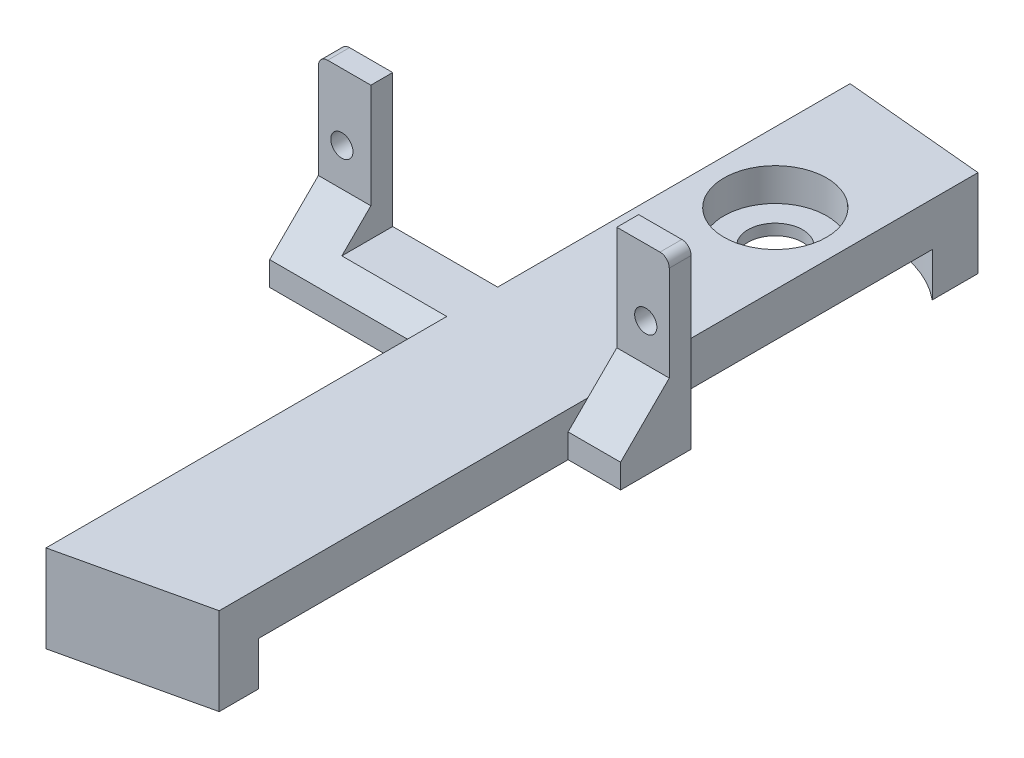
ISO-10303-21;
HEADER;
FILE_DESCRIPTION(('STEP AP214'),'2;1');
FILE_NAME('part.step','',(''),(''),'','','');
FILE_SCHEMA(('AUTOMOTIVE_DESIGN { 1 0 10303 214 1 1 1 1 }'));
ENDSEC;
DATA;
#1=APPLICATION_CONTEXT('core data for automotive mechanical design processes');
#2=APPLICATION_PROTOCOL_DEFINITION('international standard','automotive_design',2000,#1);
#3=PRODUCT_CONTEXT('',#1,'mechanical');
#4=PRODUCT('Part','Part','',(#3));
#5=PRODUCT_RELATED_PRODUCT_CATEGORY('part','',(#4));
#6=PRODUCT_DEFINITION_FORMATION('','',#4);
#7=PRODUCT_DEFINITION_CONTEXT('part definition',#1,'design');
#8=PRODUCT_DEFINITION('design','',#6,#7);
#9=PRODUCT_DEFINITION_SHAPE('','',#8);
#10=(LENGTH_UNIT() NAMED_UNIT(*) SI_UNIT(.MILLI.,.METRE.));
#11=(NAMED_UNIT(*) PLANE_ANGLE_UNIT() SI_UNIT($,.RADIAN.));
#12=(NAMED_UNIT(*) SI_UNIT($,.STERADIAN.) SOLID_ANGLE_UNIT());
#13=UNCERTAINTY_MEASURE_WITH_UNIT(LENGTH_MEASURE(1.E-05),#10,'distance_accuracy_value','');
#14=(GEOMETRIC_REPRESENTATION_CONTEXT(3) GLOBAL_UNCERTAINTY_ASSIGNED_CONTEXT((#13)) GLOBAL_UNIT_ASSIGNED_CONTEXT((#10,
#11,#12)) REPRESENTATION_CONTEXT('',''));
#15=CARTESIAN_POINT('',(0.,0.,0.));
#16=DIRECTION('',(0.,0.,1.));
#17=DIRECTION('',(1.,0.,0.));
#18=AXIS2_PLACEMENT_3D('',#15,#16,#17);
#19=CARTESIAN_POINT('',(24.0462381627888,-9.09999999999987,7.665828595555));
#20=DIRECTION('',(0.,-0.70856176119434,-0.705648801156195));
#21=DIRECTION('',(0.,0.705648801156195,-0.70856176119434));
#22=AXIS2_PLACEMENT_3D('',#19,#20,#21);
#23=PLANE('',#22);
#24=DIRECTION('',(-1.,0.,0.));
#25=VECTOR('',#24,1.);
#26=CARTESIAN_POINT('',(24.0462381627888,-7.89434521112556,6.45519679231599));
#27=LINE('',#26,#25);
#28=CARTESIAN_POINT('',(-1.64999999999999,-7.8943452111257,6.45519679231599));
#29=VERTEX_POINT('',#28);
#30=CARTESIAN_POINT('',(-16.05,-7.89434521112579,6.45519679231599));
#31=VERTEX_POINT('',#30);
#32=EDGE_CURVE('E241',#29,#31,#27,.T.);
#33=ORIENTED_EDGE('',*,*,#32,.F.);
#34=DIRECTION('',(0.,0.705648801156195,-0.70856176119434));
#35=VECTOR('',#34,1.);
#36=CARTESIAN_POINT('',(-1.65000000000002,-5.2671182257889,3.8171244584051));
#37=LINE('',#36,#35);
#38=CARTESIAN_POINT('',(-1.65000000000001,-6.10000000000001,4.65344441790159));
#39=VERTEX_POINT('',#38);
#40=EDGE_CURVE('E248',#29,#39,#37,.T.);
#41=ORIENTED_EDGE('',*,*,#40,.T.);
#42=DIRECTION('',(1.,0.,0.));
#43=VECTOR('',#42,1.);
#44=CARTESIAN_POINT('',(24.0462381627888,-6.09999999999987,4.65344441790159));
#45=LINE('',#44,#43);
#46=CARTESIAN_POINT('',(-11.25,-6.10000000000007,4.65344441790159));
#47=VERTEX_POINT('',#46);
#48=EDGE_CURVE('E424',#47,#39,#45,.T.);
#49=ORIENTED_EDGE('',*,*,#48,.F.);
#50=DIRECTION('',(0.,-0.705648801156195,0.70856176119434));
#51=VECTOR('',#50,1.);
#52=CARTESIAN_POINT('',(-11.25,-9.10000000000007,7.665828595555));
#53=LINE('',#52,#51);
#54=CARTESIAN_POINT('',(-11.25,-3.45746412666863,2.));
#55=VERTEX_POINT('',#54);
#56=EDGE_CURVE('E417',#55,#47,#53,.T.);
#57=ORIENTED_EDGE('',*,*,#56,.F.);
#58=DIRECTION('',(-1.,0.,0.));
#59=VECTOR('',#58,1.);
#60=CARTESIAN_POINT('',(24.0462381627887,-3.45746412666856,2.));
#61=LINE('',#60,#59);
#62=CARTESIAN_POINT('',(-16.05,-3.45746412666879,2.));
#63=VERTEX_POINT('',#62);
#64=EDGE_CURVE('E480',#55,#63,#61,.T.);
#65=ORIENTED_EDGE('',*,*,#64,.T.);
#66=DIRECTION('',(0.,0.705648801156195,-0.70856176119434));
#67=VECTOR('',#66,1.);
#68=CARTESIAN_POINT('',(-16.05,-9.10000000000012,7.66582859555502));
#69=LINE('',#68,#67);
#70=EDGE_CURVE('E478',#31,#63,#69,.T.);
#71=ORIENTED_EDGE('',*,*,#70,.F.);
#72=EDGE_LOOP('',(#33,#41,#49,#57,#65,#71));
#73=FACE_BOUND('',#72,.T.);
#74=ADVANCED_FACE('F35',(#73),#23,.F.);
#75=CARTESIAN_POINT('',(-16.05,0.,2.));
#76=DIRECTION('',(1.,0.,0.));
#77=DIRECTION('',(0.,1.,0.));
#78=AXIS2_PLACEMENT_3D('',#75,#76,#77);
#79=PLANE('',#78);
#80=DIRECTION('',(0.,1.,0.));
#81=VECTOR('',#80,1.);
#82=CARTESIAN_POINT('',(-16.05,-10.1000000000001,6.45519679231599));
#83=LINE('',#82,#81);
#84=CARTESIAN_POINT('',(-16.05,-10.1000000000001,6.45519679231599));
#85=VERTEX_POINT('',#84);
#86=EDGE_CURVE('E468',#85,#31,#83,.T.);
#87=ORIENTED_EDGE('',*,*,#86,.T.);
#88=ORIENTED_EDGE('',*,*,#70,.T.);
#89=DIRECTION('',(0.,-1.,0.));
#90=VECTOR('',#89,1.);
#91=CARTESIAN_POINT('',(-16.05,0.,2.));
#92=LINE('',#91,#90);
#93=CARTESIAN_POINT('',(-16.05,5.25,2.));
#94=VERTEX_POINT('',#93);
#95=EDGE_CURVE('E377',#94,#63,#92,.T.);
#96=ORIENTED_EDGE('',*,*,#95,.F.);
#97=DIRECTION('',(0.,0.,-1.));
#98=VECTOR('',#97,1.);
#99=CARTESIAN_POINT('',(-16.05,5.25,2.));
#100=LINE('',#99,#98);
#101=CARTESIAN_POINT('',(-16.05,5.25,0.));
#102=VERTEX_POINT('',#101);
#103=EDGE_CURVE('E387',#94,#102,#100,.T.);
#104=ORIENTED_EDGE('',*,*,#103,.T.);
#105=DIRECTION('',(0.,-1.,0.));
#106=VECTOR('',#105,1.);
#107=CARTESIAN_POINT('',(-16.05,0.,0.));
#108=LINE('',#107,#106);
#109=CARTESIAN_POINT('',(-16.05,-10.1000000000001,0.));
#110=VERTEX_POINT('',#109);
#111=EDGE_CURVE('E390',#102,#110,#108,.T.);
#112=ORIENTED_EDGE('',*,*,#111,.T.);
#113=DIRECTION('',(0.,0.,-1.));
#114=VECTOR('',#113,1.);
#115=CARTESIAN_POINT('',(-16.05,-10.1000000000001,6.45519679231599));
#116=LINE('',#115,#114);
#117=EDGE_CURVE('E440',#85,#110,#116,.T.);
#118=ORIENTED_EDGE('',*,*,#117,.F.);
#119=EDGE_LOOP('',(#87,#88,#96,#104,#112,#118));
#120=FACE_BOUND('',#119,.T.);
#121=ADVANCED_FACE('F539',(#120),#79,.F.);
#122=DIRECTION('',(0.,-0.705648801156195,0.70856176119434));
#123=VECTOR('',#122,1.);
#124=CARTESIAN_POINT('',(11.25,-5.26711822578882,3.8171244584051));
#125=LINE('',#124,#123);
#126=CARTESIAN_POINT('',(11.25,-6.09999999999994,4.65344441790159));
#127=VERTEX_POINT('',#126);
#128=CARTESIAN_POINT('',(11.25,-7.89434521112563,6.45519679231599));
#129=VERTEX_POINT('',#128);
#130=EDGE_CURVE('E226',#127,#129,#125,.T.);
#131=ORIENTED_EDGE('',*,*,#130,.T.);
#132=DIRECTION('',(1.,0.,0.));
#133=VECTOR('',#132,1.);
#134=CARTESIAN_POINT('',(24.0462381627888,-7.89434521112556,6.45519679231599));
#135=LINE('',#134,#133);
#136=CARTESIAN_POINT('',(16.05,-7.8943452111256,6.45519679231599));
#137=VERTEX_POINT('',#136);
#138=EDGE_CURVE('E235',#129,#137,#135,.T.);
#139=ORIENTED_EDGE('',*,*,#138,.T.);
#140=DIRECTION('',(0.,0.705648801156195,-0.70856176119434));
#141=VECTOR('',#140,1.);
#142=CARTESIAN_POINT('',(16.05,-9.09999999999991,7.665828595555));
#143=LINE('',#142,#141);
#144=CARTESIAN_POINT('',(16.05,-3.45746412666861,2.));
#145=VERTEX_POINT('',#144);
#146=EDGE_CURVE('E254',#137,#145,#143,.T.);
#147=ORIENTED_EDGE('',*,*,#146,.T.);
#148=CARTESIAN_POINT('',(11.25,-3.45746412666863,2.));
#149=VERTEX_POINT('',#148);
#150=EDGE_CURVE('E481',#145,#149,#61,.T.);
#151=ORIENTED_EDGE('',*,*,#150,.T.);
#152=DIRECTION('',(0.,0.705648801156195,-0.70856176119434));
#153=VECTOR('',#152,1.);
#154=CARTESIAN_POINT('',(11.25,-9.09999999999994,7.665828595555));
#155=LINE('',#154,#153);
#156=EDGE_CURVE('E246',#127,#149,#155,.T.);
#157=ORIENTED_EDGE('',*,*,#156,.F.);
#158=EDGE_LOOP('',(#131,#139,#147,#151,#157));
#159=FACE_BOUND('',#158,.T.);
#160=ADVANCED_FACE('F244',(#159),#23,.F.);
#161=CARTESIAN_POINT('',(0.,0.,2.));
#162=DIRECTION('',(0.,0.,1.));
#163=DIRECTION('',(1.,0.,0.));
#164=AXIS2_PLACEMENT_3D('',#161,#162,#163);
#165=PLANE('',#164);
#166=CARTESIAN_POINT('',(-13.9,0.,2.));
#167=DIRECTION('',(0.,0.,1.));
#168=DIRECTION('',(1.,0.,0.));
#169=AXIS2_PLACEMENT_3D('',#166,#167,#168);
#170=CIRCLE('',#169,1.016);
#171=CARTESIAN_POINT('',(-12.884,0.,2.));
#172=VERTEX_POINT('',#171);
#173=EDGE_CURVE('E374',#172,#172,#170,.T.);
#174=ORIENTED_EDGE('',*,*,#173,.F.);
#175=EDGE_LOOP('',(#174));
#176=FACE_BOUND('',#175,.T.);
#177=ORIENTED_EDGE('',*,*,#95,.T.);
#178=ORIENTED_EDGE('',*,*,#64,.F.);
#179=DIRECTION('',(0.,-1.,0.));
#180=VECTOR('',#179,1.);
#181=CARTESIAN_POINT('',(-11.25,0.,2.));
#182=LINE('',#181,#180);
#183=CARTESIAN_POINT('',(-11.25,6.1,2.));
#184=VERTEX_POINT('',#183);
#185=EDGE_CURVE('E381',#184,#55,#182,.T.);
#186=ORIENTED_EDGE('',*,*,#185,.F.);
#187=DIRECTION('',(-1.,0.,0.));
#188=VECTOR('',#187,1.);
#189=CARTESIAN_POINT('',(0.,6.1,2.));
#190=LINE('',#189,#188);
#191=CARTESIAN_POINT('',(-15.2,6.1,2.));
#192=VERTEX_POINT('',#191);
#193=EDGE_CURVE('E383',#184,#192,#190,.T.);
#194=ORIENTED_EDGE('',*,*,#193,.T.);
#195=CARTESIAN_POINT('',(-15.2,5.25,2.));
#196=DIRECTION('',(0.,0.,1.));
#197=DIRECTION('',(1.,0.,0.));
#198=AXIS2_PLACEMENT_3D('',#195,#196,#197);
#199=CIRCLE('',#198,0.850000000000002);
#200=EDGE_CURVE('E385',#192,#94,#199,.T.);
#201=ORIENTED_EDGE('',*,*,#200,.T.);
#202=EDGE_LOOP('',(#177,#178,#186,#194,#201));
#203=FACE_BOUND('',#202,.T.);
#204=ADVANCED_FACE('F550',(#176,#203),#165,.T.);
#205=CARTESIAN_POINT('',(0.,-9.1,2.));
#206=DIRECTION('',(0.,0.,-1.));
#207=DIRECTION('',(-1.,0.,0.));
#208=AXIS2_PLACEMENT_3D('',#205,#206,#207);
#209=PLANE('',#208);
#210=CARTESIAN_POINT('',(13.9,0.,2.));
#211=DIRECTION('',(0.,0.,1.));
#212=DIRECTION('',(1.,0.,0.));
#213=AXIS2_PLACEMENT_3D('',#210,#211,#212);
#214=CIRCLE('',#213,1.016);
#215=CARTESIAN_POINT('',(14.916,0.,2.));
#216=VERTEX_POINT('',#215);
#217=EDGE_CURVE('E302',#216,#216,#214,.T.);
#218=ORIENTED_EDGE('',*,*,#217,.F.);
#219=EDGE_LOOP('',(#218));
#220=FACE_BOUND('',#219,.T.);
#221=ORIENTED_EDGE('',*,*,#150,.F.);
#222=DIRECTION('',(0.,1.,0.));
#223=VECTOR('',#222,1.);
#224=CARTESIAN_POINT('',(16.05,-9.09999999999991,2.));
#225=LINE('',#224,#223);
#226=CARTESIAN_POINT('',(16.05,5.25,2.));
#227=VERTEX_POINT('',#226);
#228=EDGE_CURVE('E363',#145,#227,#225,.T.);
#229=ORIENTED_EDGE('',*,*,#228,.T.);
#230=CARTESIAN_POINT('',(15.2,5.25,2.));
#231=DIRECTION('',(0.,0.,1.));
#232=DIRECTION('',(1.,0.,0.));
#233=AXIS2_PLACEMENT_3D('',#230,#231,#232);
#234=CIRCLE('',#233,0.849999999999998);
#235=CARTESIAN_POINT('',(15.2,6.1,2.));
#236=VERTEX_POINT('',#235);
#237=EDGE_CURVE('E305',#227,#236,#234,.T.);
#238=ORIENTED_EDGE('',*,*,#237,.T.);
#239=DIRECTION('',(0.999998883397845,0.00149439053219066,0.));
#240=VECTOR('',#239,1.);
#241=CARTESIAN_POINT('',(-0.00908182738110785,6.07727166673534,2.));
#242=LINE('',#241,#240);
#243=CARTESIAN_POINT('',(11.25,6.09409715080671,2.));
#244=VERTEX_POINT('',#243);
#245=EDGE_CURVE('E308',#244,#236,#242,.T.);
#246=ORIENTED_EDGE('',*,*,#245,.F.);
#247=DIRECTION('',(0.,1.,0.));
#248=VECTOR('',#247,1.);
#249=CARTESIAN_POINT('',(11.25,0.,2.));
#250=LINE('',#249,#248);
#251=EDGE_CURVE('E311',#149,#244,#250,.T.);
#252=ORIENTED_EDGE('',*,*,#251,.F.);
#253=EDGE_LOOP('',(#221,#229,#238,#246,#252));
#254=FACE_BOUND('',#253,.T.);
#255=ADVANCED_FACE('F487',(#220,#254),#209,.F.);
#256=CARTESIAN_POINT('',(11.25,-9.09999999999994,0.));
#257=DIRECTION('',(-1.,0.,0.));
#258=DIRECTION('',(0.,-1.,0.));
#259=AXIS2_PLACEMENT_3D('',#256,#257,#258);
#260=PLANE('',#259);
#261=DIRECTION('',(0.,0.,1.));
#262=VECTOR('',#261,1.);
#263=CARTESIAN_POINT('',(11.25,-6.09999999999994,0.));
#264=LINE('',#263,#262);
#265=CARTESIAN_POINT('',(11.25,-6.09999999999994,38.3729605246783));
#266=VERTEX_POINT('',#265);
#267=EDGE_CURVE('E338',#127,#266,#264,.T.);
#268=ORIENTED_EDGE('',*,*,#267,.T.);
#269=DIRECTION('',(0.,1.,0.));
#270=VECTOR('',#269,1.);
#271=CARTESIAN_POINT('',(11.25,-9.09999999999994,38.3729605246783));
#272=LINE('',#271,#270);
#273=CARTESIAN_POINT('',(11.2500000000001,-14.0999999999999,38.3729605246783));
#274=VERTEX_POINT('',#273);
#275=EDGE_CURVE('E360',#274,#266,#272,.T.);
#276=ORIENTED_EDGE('',*,*,#275,.F.);
#277=DIRECTION('',(0.,0.,1.));
#278=VECTOR('',#277,1.);
#279=CARTESIAN_POINT('',(11.2500000000001,-14.0999999999999,0.));
#280=LINE('',#279,#278);
#281=CARTESIAN_POINT('',(11.2500000000001,-14.0999999999999,34.7915780127412));
#282=VERTEX_POINT('',#281);
#283=EDGE_CURVE('E285',#282,#274,#280,.T.);
#284=ORIENTED_EDGE('',*,*,#283,.F.);
#285=DIRECTION('',(0.,1.,0.));
#286=VECTOR('',#285,1.);
#287=CARTESIAN_POINT('',(11.2500000000001,-14.0999999999999,34.7915780127412));
#288=LINE('',#287,#286);
#289=CARTESIAN_POINT('',(11.25,-10.0999999999999,34.7915780127412));
#290=VERTEX_POINT('',#289);
#291=EDGE_CURVE('E299',#282,#290,#288,.T.);
#292=ORIENTED_EDGE('',*,*,#291,.T.);
#293=DIRECTION('',(0.,0.,1.));
#294=VECTOR('',#293,1.);
#295=CARTESIAN_POINT('',(11.25,-10.0999999999999,6.45519679231599));
#296=LINE('',#295,#294);
#297=CARTESIAN_POINT('',(11.25,-10.0999999999999,6.45519679231599));
#298=VERTEX_POINT('',#297);
#299=EDGE_CURVE('E50',#298,#290,#296,.T.);
#300=ORIENTED_EDGE('',*,*,#299,.F.);
#301=DIRECTION('',(0.,1.,0.));
#302=VECTOR('',#301,1.);
#303=CARTESIAN_POINT('',(11.25,-10.0999999999999,6.45519679231599));
#304=LINE('',#303,#302);
#305=EDGE_CURVE('E222',#298,#129,#304,.T.);
#306=ORIENTED_EDGE('',*,*,#305,.T.);
#307=ORIENTED_EDGE('',*,*,#130,.F.);
#308=EDGE_LOOP('',(#268,#276,#284,#292,#300,#306,#307));
#309=FACE_BOUND('',#308,.T.);
#310=ADVANCED_FACE('F224',(#309),#260,.F.);
#311=CARTESIAN_POINT('',(-1.65,-9.10000000000001,0.));
#312=DIRECTION('',(1.,0.,0.));
#313=DIRECTION('',(0.,1.,0.));
#314=AXIS2_PLACEMENT_3D('',#311,#312,#313);
#315=PLANE('',#314);
#316=ORIENTED_EDGE('',*,*,#40,.F.);
#317=DIRECTION('',(0.,1.,0.));
#318=VECTOR('',#317,1.);
#319=CARTESIAN_POINT('',(-1.64999999999999,-10.1,6.45519679231599));
#320=LINE('',#319,#318);
#321=CARTESIAN_POINT('',(-1.64999999999999,-10.1,6.45519679231599));
#322=VERTEX_POINT('',#321);
#323=EDGE_CURVE('E470',#322,#29,#320,.T.);
#324=ORIENTED_EDGE('',*,*,#323,.F.);
#325=DIRECTION('',(0.,0.,-1.));
#326=VECTOR('',#325,1.);
#327=CARTESIAN_POINT('',(-1.64999999999999,-10.1,39.1));
#328=LINE('',#327,#326);
#329=CARTESIAN_POINT('',(-1.64999999999999,-10.1,39.1));
#330=VERTEX_POINT('',#329);
#331=EDGE_CURVE('E987',#330,#322,#328,.T.);
#332=ORIENTED_EDGE('',*,*,#331,.F.);
#333=DIRECTION('',(0.,1.,0.));
#334=VECTOR('',#333,1.);
#335=CARTESIAN_POINT('',(-1.64999999999997,-14.1,39.1));
#336=LINE('',#335,#334);
#337=CARTESIAN_POINT('',(-1.64999999999997,-14.1,39.1));
#338=VERTEX_POINT('',#337);
#339=EDGE_CURVE('E58',#338,#330,#336,.T.);
#340=ORIENTED_EDGE('',*,*,#339,.F.);
#341=DIRECTION('',(0.,0.,-1.));
#342=VECTOR('',#341,1.);
#343=CARTESIAN_POINT('',(-1.64999999999997,-14.1,0.));
#344=LINE('',#343,#342);
#345=CARTESIAN_POINT('',(-1.64999999999997,-14.1,41.3173022082031));
#346=VERTEX_POINT('',#345);
#347=EDGE_CURVE('E291',#346,#338,#344,.T.);
#348=ORIENTED_EDGE('',*,*,#347,.F.);
#349=DIRECTION('',(0.,1.,0.));
#350=VECTOR('',#349,1.);
#351=CARTESIAN_POINT('',(-1.65,-9.10000000000001,41.3173022082031));
#352=LINE('',#351,#350);
#353=CARTESIAN_POINT('',(-1.65000000000002,-6.10000000000001,41.3173022082031));
#354=VERTEX_POINT('',#353);
#355=EDGE_CURVE('E358',#346,#354,#352,.T.);
#356=ORIENTED_EDGE('',*,*,#355,.T.);
#357=DIRECTION('',(0.,0.,-1.));
#358=VECTOR('',#357,1.);
#359=CARTESIAN_POINT('',(-1.65000000000002,-6.10000000000001,0.));
#360=LINE('',#359,#358);
#361=EDGE_CURVE('E343',#354,#39,#360,.T.);
#362=ORIENTED_EDGE('',*,*,#361,.T.);
#363=EDGE_LOOP('',(#316,#324,#332,#340,#348,#356,#362));
#364=FACE_BOUND('',#363,.T.);
#365=ADVANCED_FACE('F579',(#364),#315,.F.);
#366=CARTESIAN_POINT('',(0.,-6.1,0.));
#367=DIRECTION('',(0.,-1.,0.));
#368=DIRECTION('',(1.,0.,0.));
#369=AXIS2_PLACEMENT_3D('',#366,#367,#368);
#370=PLANE('',#369);
#371=DIRECTION('',(0.,0.,-1.));
#372=VECTOR('',#371,1.);
#373=CARTESIAN_POINT('',(11.25,-6.1,2.));
#374=LINE('',#373,#372);
#375=CARTESIAN_POINT('',(11.25,-6.1,0.));
#376=VERTEX_POINT('',#375);
#377=EDGE_CURVE('E313',#127,#376,#374,.T.);
#378=ORIENTED_EDGE('',*,*,#377,.T.);
#379=DIRECTION('',(0.,0.,-1.));
#380=VECTOR('',#379,1.);
#381=CARTESIAN_POINT('',(11.25,-6.09999999999994,0.));
#382=LINE('',#381,#380);
#383=CARTESIAN_POINT('',(11.25,-6.09999999999994,-31.0432795450217));
#384=VERTEX_POINT('',#383);
#385=EDGE_CURVE('E336',#376,#384,#382,.T.);
#386=ORIENTED_EDGE('',*,*,#385,.T.);
#387=DIRECTION('',(0.995722585399708,0.,0.0923933597447412));
#388=VECTOR('',#387,1.);
#389=CARTESIAN_POINT('',(2.95196043990108,-6.09999999999999,-31.8132568112745));
#390=LINE('',#389,#388);
#391=CARTESIAN_POINT('',(-1.65000000000002,-6.10000000000001,-32.2402739269747));
#392=VERTEX_POINT('',#391);
#393=EDGE_CURVE('E333',#392,#384,#390,.T.);
#394=ORIENTED_EDGE('',*,*,#393,.F.);
#395=DIRECTION('',(0.,0.,-1.));
#396=VECTOR('',#395,1.);
#397=CARTESIAN_POINT('',(-1.65000000000002,-6.10000000000001,0.));
#398=LINE('',#397,#396);
#399=CARTESIAN_POINT('',(-1.65000000000002,-6.10000000000001,0.));
#400=VERTEX_POINT('',#399);
#401=EDGE_CURVE('E348',#400,#392,#398,.T.);
#402=ORIENTED_EDGE('',*,*,#401,.F.);
#403=DIRECTION('',(-1.,0.,0.));
#404=VECTOR('',#403,1.);
#405=CARTESIAN_POINT('',(0.,-6.1,0.));
#406=LINE('',#405,#404);
#407=CARTESIAN_POINT('',(-11.25,-6.1,0.));
#408=VERTEX_POINT('',#407);
#409=EDGE_CURVE('E345',#400,#408,#406,.T.);
#410=ORIENTED_EDGE('',*,*,#409,.T.);
#411=DIRECTION('',(0.,0.,-1.));
#412=VECTOR('',#411,1.);
#413=CARTESIAN_POINT('',(-11.25,-6.1,2.));
#414=LINE('',#413,#412);
#415=EDGE_CURVE('E11',#47,#408,#414,.T.);
#416=ORIENTED_EDGE('',*,*,#415,.F.);
#417=ORIENTED_EDGE('',*,*,#48,.T.);
#418=ORIENTED_EDGE('',*,*,#361,.F.);
#419=DIRECTION('',(0.974927898017834,0.,-0.222520996012798));
#420=VECTOR('',#419,1.);
#421=CARTESIAN_POINT('',(8.88175442612116,-6.09999999999995,38.913497281267));
#422=LINE('',#421,#420);
#423=EDGE_CURVE('E340',#354,#266,#422,.T.);
#424=ORIENTED_EDGE('',*,*,#423,.T.);
#425=ORIENTED_EDGE('',*,*,#267,.F.);
#426=EDGE_LOOP('',(#378,#386,#394,#402,#410,#416,#417,#418,#424,#425));
#427=FACE_BOUND('',#426,.T.);
#428=CARTESIAN_POINT('',(4.74999999999999,-6.09999999999998,-19.));
#429=DIRECTION('',(0.,-1.,0.));
#430=DIRECTION('',(1.,0.,0.));
#431=AXIS2_PLACEMENT_3D('',#428,#429,#430);
#432=CIRCLE('',#431,4.7);
#433=CARTESIAN_POINT('',(9.45,-6.09999999999995,-19.));
#434=VERTEX_POINT('',#433);
#435=EDGE_CURVE('E350',#434,#434,#432,.T.);
#436=ORIENTED_EDGE('',*,*,#435,.T.);
#437=EDGE_LOOP('',(#436));
#438=FACE_BOUND('',#437,.T.);
#439=ADVANCED_FACE('F421',(#427,#438),#370,.F.);
#440=CARTESIAN_POINT('',(-11.25,0.,2.));
#441=DIRECTION('',(1.,0.,0.));
#442=DIRECTION('',(0.,1.,0.));
#443=AXIS2_PLACEMENT_3D('',#440,#441,#442);
#444=PLANE('',#443);
#445=ORIENTED_EDGE('',*,*,#185,.T.);
#446=ORIENTED_EDGE('',*,*,#56,.T.);
#447=ORIENTED_EDGE('',*,*,#415,.T.);
#448=DIRECTION('',(0.,-1.,0.));
#449=VECTOR('',#448,1.);
#450=CARTESIAN_POINT('',(-11.25,0.,0.));
#451=LINE('',#450,#449);
#452=CARTESIAN_POINT('',(-11.25,6.1,0.));
#453=VERTEX_POINT('',#452);
#454=EDGE_CURVE('E392',#453,#408,#451,.T.);
#455=ORIENTED_EDGE('',*,*,#454,.F.);
#456=DIRECTION('',(0.,0.,-1.));
#457=VECTOR('',#456,1.);
#458=CARTESIAN_POINT('',(-11.25,6.1,2.));
#459=LINE('',#458,#457);
#460=EDGE_CURVE('E43',#184,#453,#459,.T.);
#461=ORIENTED_EDGE('',*,*,#460,.F.);
#462=EDGE_LOOP('',(#445,#446,#447,#455,#461));
#463=FACE_BOUND('',#462,.T.);
#464=ADVANCED_FACE('F414',(#463),#444,.T.);
#465=CARTESIAN_POINT('',(0.,6.1,2.));
#466=DIRECTION('',(0.,-1.,0.));
#467=DIRECTION('',(0.,0.,-1.));
#468=AXIS2_PLACEMENT_3D('',#465,#466,#467);
#469=PLANE('',#468);
#470=DIRECTION('',(-1.,0.,0.));
#471=VECTOR('',#470,1.);
#472=CARTESIAN_POINT('',(0.,6.1,0.));
#473=LINE('',#472,#471);
#474=CARTESIAN_POINT('',(-15.2,6.1,0.));
#475=VERTEX_POINT('',#474);
#476=EDGE_CURVE('E394',#453,#475,#473,.T.);
#477=ORIENTED_EDGE('',*,*,#476,.T.);
#478=DIRECTION('',(0.,0.,-1.));
#479=VECTOR('',#478,1.);
#480=CARTESIAN_POINT('',(-15.2,6.1,2.));
#481=LINE('',#480,#479);
#482=EDGE_CURVE('E399',#192,#475,#481,.T.);
#483=ORIENTED_EDGE('',*,*,#482,.F.);
#484=ORIENTED_EDGE('',*,*,#193,.F.);
#485=ORIENTED_EDGE('',*,*,#460,.T.);
#486=EDGE_LOOP('',(#477,#483,#484,#485));
#487=FACE_BOUND('',#486,.T.);
#488=ADVANCED_FACE('F404',(#487),#469,.F.);
#489=CARTESIAN_POINT('',(-13.9,0.,2.));
#490=DIRECTION('',(0.,0.,-1.));
#491=DIRECTION('',(-1.,0.,0.));
#492=AXIS2_PLACEMENT_3D('',#489,#490,#491);
#493=CYLINDRICAL_SURFACE('',#492,1.016);
#494=ORIENTED_EDGE('',*,*,#173,.T.);
#495=EDGE_LOOP('',(#494));
#496=FACE_BOUND('',#495,.T.);
#497=CARTESIAN_POINT('',(-13.9,0.,0.));
#498=DIRECTION('',(0.,0.,1.));
#499=DIRECTION('',(1.,0.,0.));
#500=AXIS2_PLACEMENT_3D('',#497,#498,#499);
#501=CIRCLE('',#500,1.016);
#502=CARTESIAN_POINT('',(-12.884,0.,0.));
#503=VERTEX_POINT('',#502);
#504=EDGE_CURVE('E373',#503,#503,#501,.T.);
#505=ORIENTED_EDGE('',*,*,#504,.F.);
#506=EDGE_LOOP('',(#505));
#507=FACE_BOUND('',#506,.T.);
#508=ADVANCED_FACE('F37',(#496,#507),#493,.F.);
#509=CARTESIAN_POINT('',(-15.2,5.25,2.));
#510=DIRECTION('',(0.,0.,-1.));
#511=DIRECTION('',(-1.,0.,0.));
#512=AXIS2_PLACEMENT_3D('',#509,#510,#511);
#513=CYLINDRICAL_SURFACE('',#512,0.850000000000002);
#514=CARTESIAN_POINT('',(-15.2,5.25,0.));
#515=DIRECTION('',(0.,0.,1.));
#516=DIRECTION('',(1.,0.,0.));
#517=AXIS2_PLACEMENT_3D('',#514,#515,#516);
#518=CIRCLE('',#517,0.850000000000002);
#519=EDGE_CURVE('E378',#475,#102,#518,.T.);
#520=ORIENTED_EDGE('',*,*,#519,.T.);
#521=ORIENTED_EDGE('',*,*,#103,.F.);
#522=ORIENTED_EDGE('',*,*,#200,.F.);
#523=ORIENTED_EDGE('',*,*,#482,.T.);
#524=EDGE_LOOP('',(#520,#521,#522,#523));
#525=FACE_BOUND('',#524,.T.);
#526=ADVANCED_FACE('F568',(#525),#513,.T.);
#527=CARTESIAN_POINT('',(0.,0.,0.));
#528=DIRECTION('',(0.,0.,1.));
#529=DIRECTION('',(1.,0.,0.));
#530=AXIS2_PLACEMENT_3D('',#527,#528,#529);
#531=PLANE('',#530);
#532=ORIENTED_EDGE('',*,*,#504,.T.);
#533=EDGE_LOOP('',(#532));
#534=FACE_BOUND('',#533,.T.);
#535=ORIENTED_EDGE('',*,*,#111,.F.);
#536=ORIENTED_EDGE('',*,*,#519,.F.);
#537=ORIENTED_EDGE('',*,*,#476,.F.);
#538=ORIENTED_EDGE('',*,*,#454,.T.);
#539=ORIENTED_EDGE('',*,*,#409,.F.);
#540=DIRECTION('',(0.,1.,0.));
#541=VECTOR('',#540,1.);
#542=CARTESIAN_POINT('',(-1.65,-9.10000000000001,0.));
#543=LINE('',#542,#541);
#544=CARTESIAN_POINT('',(-1.64999999999999,-10.1,0.));
#545=VERTEX_POINT('',#544);
#546=EDGE_CURVE('E356',#545,#400,#543,.T.);
#547=ORIENTED_EDGE('',*,*,#546,.F.);
#548=DIRECTION('',(1.,0.,0.));
#549=VECTOR('',#548,1.);
#550=CARTESIAN_POINT('',(-16.05,-10.1000000000001,0.));
#551=LINE('',#550,#549);
#552=EDGE_CURVE('E429',#110,#545,#551,.T.);
#553=ORIENTED_EDGE('',*,*,#552,.F.);
#554=EDGE_LOOP('',(#535,#536,#537,#538,#539,#547,#553));
#555=FACE_BOUND('',#554,.T.);
#556=ADVANCED_FACE('F412',(#534,#555),#531,.F.);
#557=CARTESIAN_POINT('',(2.9519604399011,-9.09999999999999,-31.8132568112745));
#558=DIRECTION('',(-0.0923933597447412,0.,0.995722585399708));
#559=DIRECTION('',(0.995722585399708,0.,0.0923933597447412));
#560=AXIS2_PLACEMENT_3D('',#557,#558,#559);
#561=PLANE('',#560);
#562=ORIENTED_EDGE('',*,*,#393,.T.);
#563=DIRECTION('',(0.,1.,0.));
#564=VECTOR('',#563,1.);
#565=CARTESIAN_POINT('',(11.25,-9.09999999999994,-31.0432795450217));
#566=LINE('',#565,#564);
#567=CARTESIAN_POINT('',(11.2500000000001,-14.0999999999999,-31.0432795450217));
#568=VERTEX_POINT('',#567);
#569=EDGE_CURVE('E370',#568,#384,#566,.T.);
#570=ORIENTED_EDGE('',*,*,#569,.F.);
#571=DIRECTION('',(0.995722585399708,0.,0.0923933597447412));
#572=VECTOR('',#571,1.);
#573=CARTESIAN_POINT('',(2.95196043990112,-14.1,-31.8132568112745));
#574=LINE('',#573,#572);
#575=CARTESIAN_POINT('',(-1.64999999999997,-14.1,-32.2402739269747));
#576=VERTEX_POINT('',#575);
#577=EDGE_CURVE('E265',#576,#568,#574,.T.);
#578=ORIENTED_EDGE('',*,*,#577,.F.);
#579=DIRECTION('',(0.,1.,0.));
#580=VECTOR('',#579,1.);
#581=CARTESIAN_POINT('',(-1.65,-9.10000000000001,-32.2402739269747));
#582=LINE('',#581,#580);
#583=EDGE_CURVE('E353',#576,#392,#582,.T.);
#584=ORIENTED_EDGE('',*,*,#583,.T.);
#585=EDGE_LOOP('',(#562,#570,#578,#584));
#586=FACE_BOUND('',#585,.T.);
#587=ADVANCED_FACE('F514',(#586),#561,.F.);
#588=CARTESIAN_POINT('',(11.25,-9.09999999999994,0.));
#589=DIRECTION('',(1.,0.,0.));
#590=DIRECTION('',(0.,1.,0.));
#591=AXIS2_PLACEMENT_3D('',#588,#589,#590);
#592=PLANE('',#591);
#593=DIRECTION('',(0.,1.,0.));
#594=VECTOR('',#593,1.);
#595=CARTESIAN_POINT('',(11.25,-9.09999999999994,0.));
#596=LINE('',#595,#594);
#597=CARTESIAN_POINT('',(11.25,-10.0999999999999,0.));
#598=VERTEX_POINT('',#597);
#599=EDGE_CURVE('E367',#598,#376,#596,.T.);
#600=ORIENTED_EDGE('',*,*,#599,.F.);
#601=DIRECTION('',(0.,0.,1.));
#602=VECTOR('',#601,1.);
#603=CARTESIAN_POINT('',(11.25,-10.0999999999999,-26.860661549768));
#604=LINE('',#603,#602);
#605=CARTESIAN_POINT('',(11.25,-10.0999999999999,-26.8606615497679));
#606=VERTEX_POINT('',#605);
#607=EDGE_CURVE('E455',#606,#598,#604,.T.);
#608=ORIENTED_EDGE('',*,*,#607,.F.);
#609=DIRECTION('',(0.,1.,0.));
#610=VECTOR('',#609,1.);
#611=CARTESIAN_POINT('',(11.2500000000001,-14.0999999999999,-26.8606615497679));
#612=LINE('',#611,#610);
#613=CARTESIAN_POINT('',(11.2500000000001,-14.0999999999999,-26.8606615497679));
#614=VERTEX_POINT('',#613);
#615=EDGE_CURVE('E271',#614,#606,#612,.T.);
#616=ORIENTED_EDGE('',*,*,#615,.F.);
#617=DIRECTION('',(0.,0.,-1.));
#618=VECTOR('',#617,1.);
#619=CARTESIAN_POINT('',(11.2500000000001,-14.0999999999999,0.));
#620=LINE('',#619,#618);
#621=EDGE_CURVE('E268',#614,#568,#620,.T.);
#622=ORIENTED_EDGE('',*,*,#621,.T.);
#623=ORIENTED_EDGE('',*,*,#569,.T.);
#624=ORIENTED_EDGE('',*,*,#385,.F.);
#625=EDGE_LOOP('',(#600,#608,#616,#622,#623,#624));
#626=FACE_BOUND('',#625,.T.);
#627=ADVANCED_FACE('F510',(#626),#592,.T.);
#628=CARTESIAN_POINT('',(0.,-9.1,0.));
#629=DIRECTION('',(0.,0.,1.));
#630=DIRECTION('',(1.,0.,0.));
#631=AXIS2_PLACEMENT_3D('',#628,#629,#630);
#632=PLANE('',#631);
#633=ORIENTED_EDGE('',*,*,#599,.T.);
#634=DIRECTION('',(0.,1.,0.));
#635=VECTOR('',#634,1.);
#636=CARTESIAN_POINT('',(11.25,0.,0.));
#637=LINE('',#636,#635);
#638=CARTESIAN_POINT('',(11.25,6.09409715080671,0.));
#639=VERTEX_POINT('',#638);
#640=EDGE_CURVE('E306',#376,#639,#637,.T.);
#641=ORIENTED_EDGE('',*,*,#640,.T.);
#642=DIRECTION('',(0.999998883397845,0.00149439053219066,0.));
#643=VECTOR('',#642,1.);
#644=CARTESIAN_POINT('',(-0.00908182738110785,6.07727166673534,0.));
#645=LINE('',#644,#643);
#646=CARTESIAN_POINT('',(15.2,6.1,0.));
#647=VERTEX_POINT('',#646);
#648=EDGE_CURVE('E319',#639,#647,#645,.T.);
#649=ORIENTED_EDGE('',*,*,#648,.T.);
#650=CARTESIAN_POINT('',(15.2,5.25,0.));
#651=DIRECTION('',(0.,0.,1.));
#652=DIRECTION('',(1.,0.,0.));
#653=AXIS2_PLACEMENT_3D('',#650,#651,#652);
#654=CIRCLE('',#653,0.849999999999998);
#655=CARTESIAN_POINT('',(16.05,5.25,0.));
#656=VERTEX_POINT('',#655);
#657=EDGE_CURVE('E316',#656,#647,#654,.T.);
#658=ORIENTED_EDGE('',*,*,#657,.F.);
#659=DIRECTION('',(0.,1.,0.));
#660=VECTOR('',#659,1.);
#661=CARTESIAN_POINT('',(16.05,-9.09999999999991,0.));
#662=LINE('',#661,#660);
#663=CARTESIAN_POINT('',(16.05,-10.0999999999999,0.));
#664=VERTEX_POINT('',#663);
#665=EDGE_CURVE('E365',#664,#656,#662,.T.);
#666=ORIENTED_EDGE('',*,*,#665,.F.);
#667=DIRECTION('',(1.,0.,0.));
#668=VECTOR('',#667,1.);
#669=CARTESIAN_POINT('',(11.25,-10.0999999999999,0.));
#670=LINE('',#669,#668);
#671=EDGE_CURVE('E458',#598,#664,#670,.T.);
#672=ORIENTED_EDGE('',*,*,#671,.F.);
#673=EDGE_LOOP('',(#633,#641,#649,#658,#666,#672));
#674=FACE_BOUND('',#673,.T.);
#675=CARTESIAN_POINT('',(13.9,0.,0.));
#676=DIRECTION('',(0.,0.,1.));
#677=DIRECTION('',(1.,0.,0.));
#678=AXIS2_PLACEMENT_3D('',#675,#676,#677);
#679=CIRCLE('',#678,1.016);
#680=CARTESIAN_POINT('',(14.916,0.,0.));
#681=VERTEX_POINT('',#680);
#682=EDGE_CURVE('E301',#681,#681,#679,.T.);
#683=ORIENTED_EDGE('',*,*,#682,.T.);
#684=EDGE_LOOP('',(#683));
#685=FACE_BOUND('',#684,.T.);
#686=ADVANCED_FACE('F506',(#674,#685),#632,.F.);
#687=CARTESIAN_POINT('',(16.05,-9.09999999999991,0.));
#688=DIRECTION('',(-1.,0.,0.));
#689=DIRECTION('',(0.,-1.,0.));
#690=AXIS2_PLACEMENT_3D('',#687,#688,#689);
#691=PLANE('',#690);
#692=ORIENTED_EDGE('',*,*,#146,.F.);
#693=DIRECTION('',(0.,1.,0.));
#694=VECTOR('',#693,1.);
#695=CARTESIAN_POINT('',(16.05,-10.0999999999999,6.45519679231599));
#696=LINE('',#695,#694);
#697=CARTESIAN_POINT('',(16.05,-10.0999999999999,6.45519679231599));
#698=VERTEX_POINT('',#697);
#699=EDGE_CURVE('E231',#698,#137,#696,.T.);
#700=ORIENTED_EDGE('',*,*,#699,.F.);
#701=DIRECTION('',(0.,0.,1.));
#702=VECTOR('',#701,1.);
#703=CARTESIAN_POINT('',(16.05,-10.0999999999999,0.));
#704=LINE('',#703,#702);
#705=EDGE_CURVE('E461',#664,#698,#704,.T.);
#706=ORIENTED_EDGE('',*,*,#705,.F.);
#707=ORIENTED_EDGE('',*,*,#665,.T.);
#708=DIRECTION('',(0.,0.,-1.));
#709=VECTOR('',#708,1.);
#710=CARTESIAN_POINT('',(16.05,5.25,2.));
#711=LINE('',#710,#709);
#712=EDGE_CURVE('E330',#227,#656,#711,.T.);
#713=ORIENTED_EDGE('',*,*,#712,.F.);
#714=ORIENTED_EDGE('',*,*,#228,.F.);
#715=EDGE_LOOP('',(#692,#700,#706,#707,#713,#714));
#716=FACE_BOUND('',#715,.T.);
#717=ADVANCED_FACE('F490',(#716),#691,.F.);
#718=CARTESIAN_POINT('',(8.88175442612118,-9.09999999999996,38.913497281267));
#719=DIRECTION('',(0.222520996012798,0.,0.974927898017834));
#720=DIRECTION('',(0.974927898017834,0.,-0.222520996012798));
#721=AXIS2_PLACEMENT_3D('',#718,#719,#720);
#722=PLANE('',#721);
#723=ORIENTED_EDGE('',*,*,#423,.F.);
#724=ORIENTED_EDGE('',*,*,#355,.F.);
#725=DIRECTION('',(0.974927898017834,0.,-0.222520996012798));
#726=VECTOR('',#725,1.);
#727=CARTESIAN_POINT('',(8.88175442612121,-14.1,38.913497281267));
#728=LINE('',#727,#726);
#729=EDGE_CURVE('E288',#346,#274,#728,.T.);
#730=ORIENTED_EDGE('',*,*,#729,.T.);
#731=ORIENTED_EDGE('',*,*,#275,.T.);
#732=EDGE_LOOP('',(#723,#724,#730,#731));
#733=FACE_BOUND('',#732,.T.);
#734=ADVANCED_FACE('F595',(#733),#722,.T.);
#735=CARTESIAN_POINT('',(-1.65,-9.10000000000001,0.));
#736=DIRECTION('',(1.,0.,0.));
#737=DIRECTION('',(0.,1.,0.));
#738=AXIS2_PLACEMENT_3D('',#735,#736,#737);
#739=PLANE('',#738);
#740=ORIENTED_EDGE('',*,*,#401,.T.);
#741=ORIENTED_EDGE('',*,*,#583,.F.);
#742=DIRECTION('',(0.,0.,-1.));
#743=VECTOR('',#742,1.);
#744=CARTESIAN_POINT('',(-1.64999999999997,-14.1,0.));
#745=LINE('',#744,#743);
#746=CARTESIAN_POINT('',(-1.64999999999997,-14.1,-29.1007438889249));
#747=VERTEX_POINT('',#746);
#748=EDGE_CURVE('E262',#747,#576,#745,.T.);
#749=ORIENTED_EDGE('',*,*,#748,.F.);
#750=DIRECTION('',(0.,1.,0.));
#751=VECTOR('',#750,1.);
#752=CARTESIAN_POINT('',(-1.64999999999997,-14.1,-29.1007438889249));
#753=LINE('',#752,#751);
#754=CARTESIAN_POINT('',(-1.64999999999999,-10.1,-29.1007438889249));
#755=VERTEX_POINT('',#754);
#756=EDGE_CURVE('E273',#747,#755,#753,.T.);
#757=ORIENTED_EDGE('',*,*,#756,.T.);
#758=DIRECTION('',(0.,0.,-1.));
#759=VECTOR('',#758,1.);
#760=CARTESIAN_POINT('',(-1.64999999999999,-10.1,0.));
#761=LINE('',#760,#759);
#762=EDGE_CURVE('E438',#545,#755,#761,.T.);
#763=ORIENTED_EDGE('',*,*,#762,.F.);
#764=ORIENTED_EDGE('',*,*,#546,.T.);
#765=EDGE_LOOP('',(#740,#741,#749,#757,#763,#764));
#766=FACE_BOUND('',#765,.T.);
#767=ADVANCED_FACE('F442',(#766),#739,.F.);
#768=CARTESIAN_POINT('',(4.75000000000001,-9.09999999999998,-19.));
#769=DIRECTION('',(0.,1.,0.));
#770=DIRECTION('',(-1.,0.,0.));
#771=AXIS2_PLACEMENT_3D('',#768,#769,#770);
#772=CYLINDRICAL_SURFACE('',#771,4.7);
#773=CARTESIAN_POINT('',(4.75000000000001,-9.09999999999998,-19.));
#774=DIRECTION('',(0.,-1.,0.));
#775=DIRECTION('',(1.,0.,0.));
#776=AXIS2_PLACEMENT_3D('',#773,#774,#775);
#777=CIRCLE('',#776,4.7);
#778=CARTESIAN_POINT('',(9.45000000000001,-9.09999999999995,-19.));
#779=VERTEX_POINT('',#778);
#780=EDGE_CURVE('E472',#779,#779,#777,.T.);
#781=ORIENTED_EDGE('',*,*,#780,.T.);
#782=EDGE_LOOP('',(#781));
#783=FACE_BOUND('',#782,.T.);
#784=ORIENTED_EDGE('',*,*,#435,.F.);
#785=EDGE_LOOP('',(#784));
#786=FACE_BOUND('',#785,.T.);
#787=ADVANCED_FACE('F590',(#783,#786),#772,.F.);
#788=CARTESIAN_POINT('',(15.2,5.25,2.));
#789=DIRECTION('',(0.,0.,-1.));
#790=DIRECTION('',(-1.,0.,0.));
#791=AXIS2_PLACEMENT_3D('',#788,#789,#790);
#792=CYLINDRICAL_SURFACE('',#791,0.849999999999998);
#793=ORIENTED_EDGE('',*,*,#657,.T.);
#794=DIRECTION('',(0.,0.,-1.));
#795=VECTOR('',#794,1.);
#796=CARTESIAN_POINT('',(15.2,6.1,2.));
#797=LINE('',#796,#795);
#798=EDGE_CURVE('E328',#236,#647,#797,.T.);
#799=ORIENTED_EDGE('',*,*,#798,.F.);
#800=ORIENTED_EDGE('',*,*,#237,.F.);
#801=ORIENTED_EDGE('',*,*,#712,.T.);
#802=EDGE_LOOP('',(#793,#799,#800,#801));
#803=FACE_BOUND('',#802,.T.);
#804=ADVANCED_FACE('F496',(#803),#792,.T.);
#805=CARTESIAN_POINT('',(-0.00908182738110785,6.07727166673534,2.));
#806=DIRECTION('',(-0.00149439053219066,0.999998883397845,0.));
#807=DIRECTION('',(-0.999998883397845,-0.00149439053219066,0.));
#808=AXIS2_PLACEMENT_3D('',#805,#806,#807);
#809=PLANE('',#808);
#810=ORIENTED_EDGE('',*,*,#648,.F.);
#811=DIRECTION('',(0.,0.,-1.));
#812=VECTOR('',#811,1.);
#813=CARTESIAN_POINT('',(11.25,6.09409715080671,2.));
#814=LINE('',#813,#812);
#815=EDGE_CURVE('E325',#244,#639,#814,.T.);
#816=ORIENTED_EDGE('',*,*,#815,.F.);
#817=ORIENTED_EDGE('',*,*,#245,.T.);
#818=ORIENTED_EDGE('',*,*,#798,.T.);
#819=EDGE_LOOP('',(#810,#816,#817,#818));
#820=FACE_BOUND('',#819,.T.);
#821=ADVANCED_FACE('F500',(#820),#809,.T.);
#822=CARTESIAN_POINT('',(11.25,0.,2.));
#823=DIRECTION('',(-1.,0.,0.));
#824=DIRECTION('',(0.,-1.,0.));
#825=AXIS2_PLACEMENT_3D('',#822,#823,#824);
#826=PLANE('',#825);
#827=ORIENTED_EDGE('',*,*,#815,.T.);
#828=ORIENTED_EDGE('',*,*,#640,.F.);
#829=ORIENTED_EDGE('',*,*,#377,.F.);
#830=ORIENTED_EDGE('',*,*,#156,.T.);
#831=ORIENTED_EDGE('',*,*,#251,.T.);
#832=EDGE_LOOP('',(#827,#828,#829,#830,#831));
#833=FACE_BOUND('',#832,.T.);
#834=ADVANCED_FACE('F502',(#833),#826,.T.);
#835=CARTESIAN_POINT('',(13.9,0.,2.));
#836=DIRECTION('',(0.,0.,-1.));
#837=DIRECTION('',(-1.,0.,0.));
#838=AXIS2_PLACEMENT_3D('',#835,#836,#837);
#839=CYLINDRICAL_SURFACE('',#838,1.016);
#840=ORIENTED_EDGE('',*,*,#217,.T.);
#841=EDGE_LOOP('',(#840));
#842=FACE_BOUND('',#841,.T.);
#843=ORIENTED_EDGE('',*,*,#682,.F.);
#844=EDGE_LOOP('',(#843));
#845=FACE_BOUND('',#844,.T.);
#846=ADVANCED_FACE('F588',(#842,#845),#839,.F.);
#847=CARTESIAN_POINT('',(4.75000000000002,-14.1,27.1922359359558));
#848=DIRECTION('',(0.,1.,0.));
#849=DIRECTION('',(-1.,0.,0.));
#850=AXIS2_PLACEMENT_3D('',#847,#848,#849);
#851=CYLINDRICAL_SURFACE('',#850,10.);
#852=CARTESIAN_POINT('',(4.75,-10.1,27.1922359359558));
#853=DIRECTION('',(0.,-1.,0.));
#854=DIRECTION('',(1.,0.,0.));
#855=AXIS2_PLACEMENT_3D('',#852,#853,#854);
#856=CIRCLE('',#855,9.99999999999999);
#857=CARTESIAN_POINT('',(7.17535625036333,-10.1,36.8936609374092));
#858=VERTEX_POINT('',#857);
#859=EDGE_CURVE('E232',#290,#858,#856,.T.);
#860=ORIENTED_EDGE('',*,*,#859,.F.);
#861=ORIENTED_EDGE('',*,*,#291,.F.);
#862=CARTESIAN_POINT('',(4.75000000000002,-14.1,27.1922359359558));
#863=DIRECTION('',(0.,-1.,0.));
#864=DIRECTION('',(1.,0.,0.));
#865=AXIS2_PLACEMENT_3D('',#862,#863,#864);
#866=CIRCLE('',#865,10.);
#867=CARTESIAN_POINT('',(7.17535625036335,-14.1,36.8936609374092));
#868=VERTEX_POINT('',#867);
#869=EDGE_CURVE('E282',#282,#868,#866,.T.);
#870=ORIENTED_EDGE('',*,*,#869,.T.);
#871=DIRECTION('',(0.,1.,0.));
#872=VECTOR('',#871,1.);
#873=CARTESIAN_POINT('',(7.17535625036335,-14.1,36.8936609374092));
#874=LINE('',#873,#872);
#875=EDGE_CURVE('E295',#868,#858,#874,.T.);
#876=ORIENTED_EDGE('',*,*,#875,.T.);
#877=EDGE_LOOP('',(#860,#861,#870,#876));
#878=FACE_BOUND('',#877,.T.);
#879=ADVANCED_FACE('F683',(#878),#851,.F.);
#880=CARTESIAN_POINT('',(9.10294117647066,-14.1,36.4117647058823));
#881=DIRECTION('',(0.242535625036333,0.,0.970142500145332));
#882=DIRECTION('',(0.970142500145332,0.,-0.242535625036333));
#883=AXIS2_PLACEMENT_3D('',#880,#881,#882);
#884=PLANE('',#883);
#885=ORIENTED_EDGE('',*,*,#339,.T.);
#886=DIRECTION('',(-0.970142500145332,0.,0.242535625036332));
#887=VECTOR('',#886,1.);
#888=CARTESIAN_POINT('',(7.17535625036333,-10.1,36.8936609374092));
#889=LINE('',#888,#887);
#890=EDGE_CURVE('E986',#858,#330,#889,.T.);
#891=ORIENTED_EDGE('',*,*,#890,.F.);
#892=ORIENTED_EDGE('',*,*,#875,.F.);
#893=DIRECTION('',(0.970142500145332,0.,-0.242535625036333));
#894=VECTOR('',#893,1.);
#895=CARTESIAN_POINT('',(9.10294117647066,-14.1,36.4117647058823));
#896=LINE('',#895,#894);
#897=EDGE_CURVE('E293',#338,#868,#896,.T.);
#898=ORIENTED_EDGE('',*,*,#897,.F.);
#899=EDGE_LOOP('',(#885,#891,#892,#898));
#900=FACE_BOUND('',#899,.T.);
#901=ADVANCED_FACE('F535',(#900),#884,.F.);
#902=CARTESIAN_POINT('',(0.,-14.1,0.));
#903=DIRECTION('',(0.,-1.,0.));
#904=DIRECTION('',(1.,0.,0.));
#905=AXIS2_PLACEMENT_3D('',#902,#903,#904);
#906=PLANE('',#905);
#907=ORIENTED_EDGE('',*,*,#869,.F.);
#908=ORIENTED_EDGE('',*,*,#283,.T.);
#909=ORIENTED_EDGE('',*,*,#729,.F.);
#910=ORIENTED_EDGE('',*,*,#347,.T.);
#911=ORIENTED_EDGE('',*,*,#897,.T.);
#912=EDGE_LOOP('',(#907,#908,#909,#910,#911));
#913=FACE_BOUND('',#912,.T.);
#914=ADVANCED_FACE('F528',(#913),#906,.T.);
#915=CARTESIAN_POINT('',(4.75000000000003,-14.1,-19.));
#916=DIRECTION('',(0.,1.,0.));
#917=DIRECTION('',(-1.,0.,0.));
#918=AXIS2_PLACEMENT_3D('',#915,#916,#917);
#919=CYLINDRICAL_SURFACE('',#918,10.2);
#920=CARTESIAN_POINT('',(4.75000000000001,-10.1,-19.));
#921=DIRECTION('',(0.,-1.,0.));
#922=DIRECTION('',(1.,0.,0.));
#923=AXIS2_PLACEMENT_3D('',#920,#921,#922);
#924=CIRCLE('',#923,10.2);
#925=CARTESIAN_POINT('',(4.75000000000002,-10.1,-29.2));
#926=VERTEX_POINT('',#925);
#927=EDGE_CURVE('E452',#926,#606,#924,.T.);
#928=ORIENTED_EDGE('',*,*,#927,.F.);
#929=DIRECTION('',(0.,1.,0.));
#930=VECTOR('',#929,1.);
#931=CARTESIAN_POINT('',(4.75000000000004,-14.1,-29.2));
#932=LINE('',#931,#930);
#933=CARTESIAN_POINT('',(4.75000000000004,-14.1,-29.2));
#934=VERTEX_POINT('',#933);
#935=EDGE_CURVE('E279',#934,#926,#932,.T.);
#936=ORIENTED_EDGE('',*,*,#935,.F.);
#937=CARTESIAN_POINT('',(4.75000000000003,-14.1,-19.));
#938=DIRECTION('',(0.,-1.,0.));
#939=DIRECTION('',(1.,0.,0.));
#940=AXIS2_PLACEMENT_3D('',#937,#938,#939);
#941=CIRCLE('',#940,10.2);
#942=EDGE_CURVE('E247',#934,#614,#941,.T.);
#943=ORIENTED_EDGE('',*,*,#942,.T.);
#944=ORIENTED_EDGE('',*,*,#615,.T.);
#945=EDGE_LOOP('',(#928,#936,#943,#944));
#946=FACE_BOUND('',#945,.T.);
#947=ADVANCED_FACE('F526',(#946),#919,.F.);
#948=CARTESIAN_POINT('',(0.,-14.1,-29.2));
#949=DIRECTION('',(0.,0.,-1.));
#950=DIRECTION('',(-1.,0.,0.));
#951=AXIS2_PLACEMENT_3D('',#948,#949,#950);
#952=PLANE('',#951);
#953=ORIENTED_EDGE('',*,*,#935,.T.);
#954=DIRECTION('',(1.,0.,0.));
#955=VECTOR('',#954,1.);
#956=CARTESIAN_POINT('',(0.350023777820612,-10.1,-29.2));
#957=LINE('',#956,#955);
#958=CARTESIAN_POINT('',(0.350023777820612,-10.1,-29.2));
#959=VERTEX_POINT('',#958);
#960=EDGE_CURVE('E446',#959,#926,#957,.T.);
#961=ORIENTED_EDGE('',*,*,#960,.F.);
#962=DIRECTION('',(0.,1.,0.));
#963=VECTOR('',#962,1.);
#964=CARTESIAN_POINT('',(0.350023777820635,-14.1,-29.2));
#965=LINE('',#964,#963);
#966=CARTESIAN_POINT('',(0.350023777820635,-14.1,-29.2));
#967=VERTEX_POINT('',#966);
#968=EDGE_CURVE('E276',#967,#959,#965,.T.);
#969=ORIENTED_EDGE('',*,*,#968,.F.);
#970=DIRECTION('',(-1.,0.,0.));
#971=VECTOR('',#970,1.);
#972=CARTESIAN_POINT('',(0.,-14.1,-29.2));
#973=LINE('',#972,#971);
#974=EDGE_CURVE('E251',#934,#967,#973,.T.);
#975=ORIENTED_EDGE('',*,*,#974,.F.);
#976=EDGE_LOOP('',(#953,#961,#969,#975));
#977=FACE_BOUND('',#976,.T.);
#978=ADVANCED_FACE('F524',(#977),#952,.F.);
#979=CARTESIAN_POINT('',(0.350023777820639,-14.1,-9.00000000000001));
#980=DIRECTION('',(0.,1.,0.));
#981=DIRECTION('',(-1.,0.,0.));
#982=AXIS2_PLACEMENT_3D('',#979,#980,#981);
#983=CYLINDRICAL_SURFACE('',#982,20.2);
#984=CARTESIAN_POINT('',(0.350023777820616,-10.1,-9.00000000000001));
#985=DIRECTION('',(0.,-1.,0.));
#986=DIRECTION('',(1.,0.,0.));
#987=AXIS2_PLACEMENT_3D('',#984,#985,#986);
#988=CIRCLE('',#987,20.2);
#989=EDGE_CURVE('E444',#755,#959,#988,.T.);
#990=ORIENTED_EDGE('',*,*,#989,.F.);
#991=ORIENTED_EDGE('',*,*,#756,.F.);
#992=CARTESIAN_POINT('',(0.350023777820639,-14.1,-9.00000000000001));
#993=DIRECTION('',(0.,-1.,0.));
#994=DIRECTION('',(1.,0.,0.));
#995=AXIS2_PLACEMENT_3D('',#992,#993,#994);
#996=CIRCLE('',#995,20.2);
#997=EDGE_CURVE('E259',#747,#967,#996,.T.);
#998=ORIENTED_EDGE('',*,*,#997,.T.);
#999=ORIENTED_EDGE('',*,*,#968,.T.);
#1000=EDGE_LOOP('',(#990,#991,#998,#999));
#1001=FACE_BOUND('',#1000,.T.);
#1002=ADVANCED_FACE('F522',(#1001),#983,.F.);
#1003=CARTESIAN_POINT('',(0.,-14.1,0.));
#1004=DIRECTION('',(0.,-1.,0.));
#1005=DIRECTION('',(1.,0.,0.));
#1006=AXIS2_PLACEMENT_3D('',#1003,#1004,#1005);
#1007=PLANE('',#1006);
#1008=ORIENTED_EDGE('',*,*,#942,.F.);
#1009=ORIENTED_EDGE('',*,*,#974,.T.);
#1010=ORIENTED_EDGE('',*,*,#997,.F.);
#1011=ORIENTED_EDGE('',*,*,#748,.T.);
#1012=ORIENTED_EDGE('',*,*,#577,.T.);
#1013=ORIENTED_EDGE('',*,*,#621,.F.);
#1014=EDGE_LOOP('',(#1008,#1009,#1010,#1011,#1012,#1013));
#1015=FACE_BOUND('',#1014,.T.);
#1016=ADVANCED_FACE('F518',(#1015),#1007,.T.);
#1017=CARTESIAN_POINT('',(0.350023777820616,-10.1,-9.00000000000001));
#1018=DIRECTION('',(0.,-1.,0.));
#1019=DIRECTION('',(1.,0.,0.));
#1020=AXIS2_PLACEMENT_3D('',#1017,#1018,#1019);
#1021=PLANE('',#1020);
#1022=ORIENTED_EDGE('',*,*,#890,.T.);
#1023=ORIENTED_EDGE('',*,*,#331,.T.);
#1024=DIRECTION('',(-1.,0.,0.));
#1025=VECTOR('',#1024,1.);
#1026=CARTESIAN_POINT('',(-1.64999999999999,-10.1,6.45519679231599));
#1027=LINE('',#1026,#1025);
#1028=EDGE_CURVE('E990',#322,#85,#1027,.T.);
#1029=ORIENTED_EDGE('',*,*,#1028,.T.);
#1030=ORIENTED_EDGE('',*,*,#117,.T.);
#1031=ORIENTED_EDGE('',*,*,#552,.T.);
#1032=ORIENTED_EDGE('',*,*,#762,.T.);
#1033=ORIENTED_EDGE('',*,*,#989,.T.);
#1034=ORIENTED_EDGE('',*,*,#960,.T.);
#1035=ORIENTED_EDGE('',*,*,#927,.T.);
#1036=ORIENTED_EDGE('',*,*,#607,.T.);
#1037=ORIENTED_EDGE('',*,*,#671,.T.);
#1038=ORIENTED_EDGE('',*,*,#705,.T.);
#1039=DIRECTION('',(-1.,0.,0.));
#1040=VECTOR('',#1039,1.);
#1041=CARTESIAN_POINT('',(16.05,-10.0999999999999,6.45519679231599));
#1042=LINE('',#1041,#1040);
#1043=EDGE_CURVE('E463',#698,#298,#1042,.T.);
#1044=ORIENTED_EDGE('',*,*,#1043,.T.);
#1045=ORIENTED_EDGE('',*,*,#299,.T.);
#1046=ORIENTED_EDGE('',*,*,#859,.T.);
#1047=EDGE_LOOP('',(#1022,#1023,#1029,#1030,#1031,#1032,#1033,#1034,#1035,#1036,#1037,#1038,
#1044,#1045,#1046));
#1048=FACE_BOUND('',#1047,.T.);
#1049=CARTESIAN_POINT('',(4.75000000000001,-10.1,-19.));
#1050=DIRECTION('',(0.,-1.,0.));
#1051=DIRECTION('',(1.,0.,0.));
#1052=AXIS2_PLACEMENT_3D('',#1049,#1050,#1051);
#1053=CIRCLE('',#1052,2.5);
#1054=CARTESIAN_POINT('',(7.25000000000001,-10.1,-19.));
#1055=VERTEX_POINT('',#1054);
#1056=EDGE_CURVE('E988',#1055,#1055,#1053,.T.);
#1057=ORIENTED_EDGE('',*,*,#1056,.F.);
#1058=EDGE_LOOP('',(#1057));
#1059=FACE_BOUND('',#1058,.T.);
#1060=ADVANCED_FACE('F435',(#1048,#1059),#1021,.T.);
#1061=CARTESIAN_POINT('',(0.35002377782061,-9.1,-9.00000000000001));
#1062=DIRECTION('',(0.,-1.,0.));
#1063=DIRECTION('',(1.,0.,0.));
#1064=AXIS2_PLACEMENT_3D('',#1061,#1062,#1063);
#1065=PLANE('',#1064);
#1066=ORIENTED_EDGE('',*,*,#780,.F.);
#1067=EDGE_LOOP('',(#1066));
#1068=FACE_BOUND('',#1067,.T.);
#1069=CARTESIAN_POINT('',(4.75000000000001,-9.09999999999998,-19.));
#1070=DIRECTION('',(0.,-1.,0.));
#1071=DIRECTION('',(1.,0.,0.));
#1072=AXIS2_PLACEMENT_3D('',#1069,#1070,#1071);
#1073=CIRCLE('',#1072,2.5);
#1074=CARTESIAN_POINT('',(7.25,-9.09999999999996,-19.));
#1075=VERTEX_POINT('',#1074);
#1076=EDGE_CURVE('E240',#1075,#1075,#1073,.T.);
#1077=ORIENTED_EDGE('',*,*,#1076,.T.);
#1078=EDGE_LOOP('',(#1077));
#1079=FACE_BOUND('',#1078,.T.);
#1080=ADVANCED_FACE('F747',(#1068,#1079),#1065,.F.);
#1081=CARTESIAN_POINT('',(-1.64999999999999,-10.1,6.45519679231599));
#1082=DIRECTION('',(0.,0.,-1.));
#1083=DIRECTION('',(-1.,0.,0.));
#1084=AXIS2_PLACEMENT_3D('',#1081,#1082,#1083);
#1085=PLANE('',#1084);
#1086=ORIENTED_EDGE('',*,*,#323,.T.);
#1087=ORIENTED_EDGE('',*,*,#32,.T.);
#1088=ORIENTED_EDGE('',*,*,#86,.F.);
#1089=ORIENTED_EDGE('',*,*,#1028,.F.);
#1090=EDGE_LOOP('',(#1086,#1087,#1088,#1089));
#1091=FACE_BOUND('',#1090,.T.);
#1092=ADVANCED_FACE('F756',(#1091),#1085,.F.);
#1093=CARTESIAN_POINT('',(16.05,-10.0999999999999,6.45519679231599));
#1094=DIRECTION('',(0.,0.,-1.));
#1095=DIRECTION('',(-1.,0.,0.));
#1096=AXIS2_PLACEMENT_3D('',#1093,#1094,#1095);
#1097=PLANE('',#1096);
#1098=ORIENTED_EDGE('',*,*,#699,.T.);
#1099=ORIENTED_EDGE('',*,*,#138,.F.);
#1100=ORIENTED_EDGE('',*,*,#305,.F.);
#1101=ORIENTED_EDGE('',*,*,#1043,.F.);
#1102=EDGE_LOOP('',(#1098,#1099,#1100,#1101));
#1103=FACE_BOUND('',#1102,.T.);
#1104=ADVANCED_FACE('F236',(#1103),#1097,.F.);
#1105=CARTESIAN_POINT('',(4.75000000000001,-10.1,-19.));
#1106=DIRECTION('',(0.,1.,0.));
#1107=DIRECTION('',(-1.,0.,0.));
#1108=AXIS2_PLACEMENT_3D('',#1105,#1106,#1107);
#1109=CYLINDRICAL_SURFACE('',#1108,2.5);
#1110=ORIENTED_EDGE('',*,*,#1056,.T.);
#1111=EDGE_LOOP('',(#1110));
#1112=FACE_BOUND('',#1111,.T.);
#1113=ORIENTED_EDGE('',*,*,#1076,.F.);
#1114=EDGE_LOOP('',(#1113));
#1115=FACE_BOUND('',#1114,.T.);
#1116=ADVANCED_FACE('F776',(#1112,#1115),#1109,.F.);
#1117=CLOSED_SHELL('',(#74,#121,#160,#204,#255,#310,#365,#439,#464,#488,#508,#526,#556,#587,
#627,#686,#717,#734,#767,#787,#804,#821,#834,#846,#879,#901,#914,#947,#978,#1002,#1016,#1060,
#1080,#1092,#1104,#1116));
#1118=MANIFOLD_SOLID_BREP('B2',#1117);
#1119=ADVANCED_BREP_SHAPE_REPRESENTATION('',(#18,#1118),#14);
#1120=SHAPE_DEFINITION_REPRESENTATION(#9,#1119);
ENDSEC;
END-ISO-10303-21;
